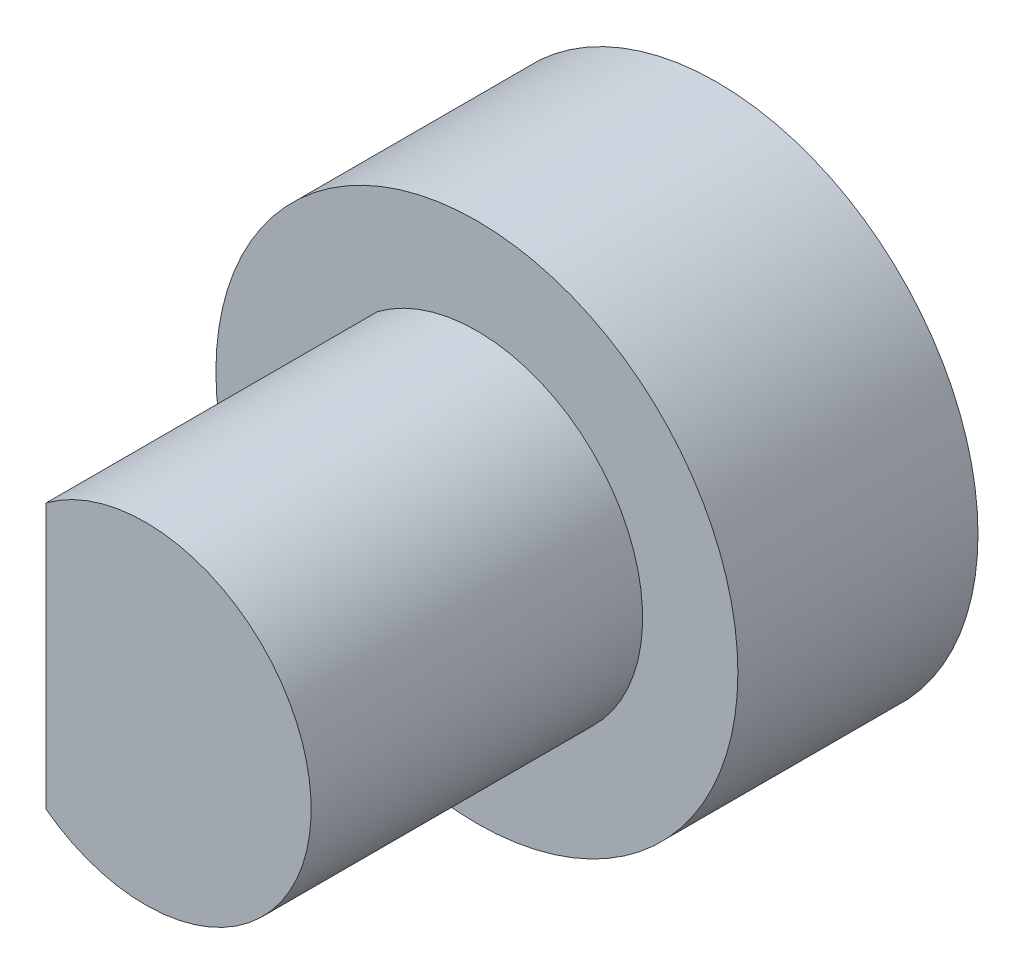
ISO-10303-21;
HEADER;
FILE_DESCRIPTION(('STEP AP214'),'2;1');
FILE_NAME('part.step','',(''),(''),'','','');
FILE_SCHEMA(('AUTOMOTIVE_DESIGN { 1 0 10303 214 1 1 1 1 }'));
ENDSEC;
DATA;
#1=APPLICATION_CONTEXT('core data for automotive mechanical design processes');
#2=APPLICATION_PROTOCOL_DEFINITION('international standard','automotive_design',2000,#1);
#3=PRODUCT_CONTEXT('',#1,'mechanical');
#4=PRODUCT('Part','Part','',(#3));
#5=PRODUCT_RELATED_PRODUCT_CATEGORY('part','',(#4));
#6=PRODUCT_DEFINITION_FORMATION('','',#4);
#7=PRODUCT_DEFINITION_CONTEXT('part definition',#1,'design');
#8=PRODUCT_DEFINITION('design','',#6,#7);
#9=PRODUCT_DEFINITION_SHAPE('','',#8);
#10=(LENGTH_UNIT() NAMED_UNIT(*) SI_UNIT(.MILLI.,.METRE.));
#11=(NAMED_UNIT(*) PLANE_ANGLE_UNIT() SI_UNIT($,.RADIAN.));
#12=(NAMED_UNIT(*) SI_UNIT($,.STERADIAN.) SOLID_ANGLE_UNIT());
#13=UNCERTAINTY_MEASURE_WITH_UNIT(LENGTH_MEASURE(1.E-05),#10,'distance_accuracy_value','');
#14=(GEOMETRIC_REPRESENTATION_CONTEXT(3) GLOBAL_UNCERTAINTY_ASSIGNED_CONTEXT((#13)) GLOBAL_UNIT_ASSIGNED_CONTEXT((#10,
#11,#12)) REPRESENTATION_CONTEXT('',''));
#15=CARTESIAN_POINT('',(0.,0.,0.));
#16=DIRECTION('',(0.,0.,1.));
#17=DIRECTION('',(1.,0.,0.));
#18=AXIS2_PLACEMENT_3D('',#15,#16,#17);
#19=CARTESIAN_POINT('',(0.,0.,3.05));
#20=DIRECTION('',(0.,0.,1.));
#21=DIRECTION('',(1.,0.,0.));
#22=AXIS2_PLACEMENT_3D('',#19,#20,#21);
#23=PLANE('',#22);
#24=CARTESIAN_POINT('',(0.,0.,3.05));
#25=DIRECTION('',(0.,0.,-1.));
#26=DIRECTION('',(-1.,0.,0.));
#27=AXIS2_PLACEMENT_3D('',#24,#25,#26);
#28=CIRCLE('',#27,1.3890625);
#29=CARTESIAN_POINT('',(-1.3890625,0.,3.05));
#30=VERTEX_POINT('',#29);
#31=EDGE_CURVE('E85',#30,#30,#28,.T.);
#32=ORIENTED_EDGE('',*,*,#31,.F.);
#33=EDGE_LOOP('',(#32));
#34=FACE_BOUND('',#33,.T.);
#35=CARTESIAN_POINT('',(0.,0.,3.05));
#36=DIRECTION('',(0.,0.,-1.));
#37=DIRECTION('',(-1.,0.,0.));
#38=AXIS2_PLACEMENT_3D('',#35,#36,#37);
#39=CIRCLE('',#38,5.);
#40=CARTESIAN_POINT('',(-5.,0.,3.05));
#41=VERTEX_POINT('',#40);
#42=EDGE_CURVE('E69',#41,#41,#39,.T.);
#43=ORIENTED_EDGE('',*,*,#42,.T.);
#44=EDGE_LOOP('',(#43));
#45=FACE_BOUND('',#44,.T.);
#46=ADVANCED_FACE('F36',(#34,#45),#23,.F.);
#47=CARTESIAN_POINT('',(0.,0.,21.7921356237309));
#48=DIRECTION('',(0.,0.,-1.));
#49=DIRECTION('',(-1.,0.,0.));
#50=AXIS2_PLACEMENT_3D('',#47,#48,#49);
#51=CYLINDRICAL_SURFACE('',#50,5.);
#52=ORIENTED_EDGE('',*,*,#42,.F.);
#53=EDGE_LOOP('',(#52));
#54=FACE_BOUND('',#53,.T.);
#55=CARTESIAN_POINT('',(0.,0.,7.65));
#56=DIRECTION('',(0.,0.,1.));
#57=DIRECTION('',(1.,0.,0.));
#58=AXIS2_PLACEMENT_3D('',#55,#56,#57);
#59=CIRCLE('',#58,5.);
#60=CARTESIAN_POINT('',(5.,0.,7.65));
#61=VERTEX_POINT('',#60);
#62=EDGE_CURVE('E77',#61,#61,#59,.F.);
#63=ORIENTED_EDGE('',*,*,#62,.T.);
#64=EDGE_LOOP('',(#63));
#65=FACE_BOUND('',#64,.T.);
#66=ADVANCED_FACE('F94',(#54,#65),#51,.T.);
#67=CARTESIAN_POINT('',(0.,0.,14.));
#68=DIRECTION('',(0.,0.,1.));
#69=DIRECTION('',(1.,0.,0.));
#70=AXIS2_PLACEMENT_3D('',#67,#68,#69);
#71=PLANE('',#70);
#72=DIRECTION('',(0.,1.,0.));
#73=VECTOR('',#72,1.);
#74=CARTESIAN_POINT('',(-1.905,2.54,14.));
#75=LINE('',#74,#73);
#76=CARTESIAN_POINT('',(-1.905,-2.54,14.));
#77=VERTEX_POINT('',#76);
#78=CARTESIAN_POINT('',(-1.905,2.54,14.));
#79=VERTEX_POINT('',#78);
#80=EDGE_CURVE('E68',#77,#79,#75,.T.);
#81=ORIENTED_EDGE('',*,*,#80,.F.);
#82=CARTESIAN_POINT('',(0.,0.,14.));
#83=DIRECTION('',(0.,0.,1.));
#84=DIRECTION('',(1.,0.,0.));
#85=AXIS2_PLACEMENT_3D('',#82,#83,#84);
#86=CIRCLE('',#85,3.175);
#87=EDGE_CURVE('E12',#77,#79,#86,.T.);
#88=ORIENTED_EDGE('',*,*,#87,.T.);
#89=EDGE_LOOP('',(#81,#88));
#90=FACE_BOUND('',#89,.T.);
#91=ADVANCED_FACE('F100',(#90),#71,.T.);
#92=CARTESIAN_POINT('',(0.,0.,7.65));
#93=DIRECTION('',(0.,0.,1.));
#94=DIRECTION('',(1.,0.,0.));
#95=AXIS2_PLACEMENT_3D('',#92,#93,#94);
#96=PLANE('',#95);
#97=DIRECTION('',(0.,1.,0.));
#98=VECTOR('',#97,1.);
#99=CARTESIAN_POINT('',(-1.905,2.54,7.65));
#100=LINE('',#99,#98);
#101=CARTESIAN_POINT('',(-1.905,-2.54,7.65));
#102=VERTEX_POINT('',#101);
#103=CARTESIAN_POINT('',(-1.905,2.54,7.65));
#104=VERTEX_POINT('',#103);
#105=EDGE_CURVE('E67',#102,#104,#100,.T.);
#106=ORIENTED_EDGE('',*,*,#105,.T.);
#107=CARTESIAN_POINT('',(0.,0.,7.65));
#108=DIRECTION('',(0.,0.,1.));
#109=DIRECTION('',(1.,0.,0.));
#110=AXIS2_PLACEMENT_3D('',#107,#108,#109);
#111=CIRCLE('',#110,3.175);
#112=EDGE_CURVE('E59',#102,#104,#111,.T.);
#113=ORIENTED_EDGE('',*,*,#112,.F.);
#114=EDGE_LOOP('',(#106,#113));
#115=FACE_BOUND('',#114,.T.);
#116=ORIENTED_EDGE('',*,*,#62,.F.);
#117=EDGE_LOOP('',(#116));
#118=FACE_BOUND('',#117,.T.);
#119=ADVANCED_FACE('F65',(#115,#118),#96,.T.);
#120=CARTESIAN_POINT('',(-1.905,2.54,7.65));
#121=DIRECTION('',(1.,0.,0.));
#122=DIRECTION('',(0.,0.,-1.));
#123=AXIS2_PLACEMENT_3D('',#120,#121,#122);
#124=PLANE('',#123);
#125=ORIENTED_EDGE('',*,*,#80,.T.);
#126=DIRECTION('',(0.,0.,1.));
#127=VECTOR('',#126,1.);
#128=CARTESIAN_POINT('',(-1.905,2.54,7.65));
#129=LINE('',#128,#127);
#130=EDGE_CURVE('E44',#104,#79,#129,.T.);
#131=ORIENTED_EDGE('',*,*,#130,.F.);
#132=ORIENTED_EDGE('',*,*,#105,.F.);
#133=DIRECTION('',(0.,0.,1.));
#134=VECTOR('',#133,1.);
#135=CARTESIAN_POINT('',(-1.905,-2.54,7.65));
#136=LINE('',#135,#134);
#137=EDGE_CURVE('E51',#102,#77,#136,.T.);
#138=ORIENTED_EDGE('',*,*,#137,.T.);
#139=EDGE_LOOP('',(#125,#131,#132,#138));
#140=FACE_BOUND('',#139,.T.);
#141=ADVANCED_FACE('F71',(#140),#124,.F.);
#142=CARTESIAN_POINT('',(0.,0.,14.));
#143=DIRECTION('',(0.,0.,-1.));
#144=DIRECTION('',(-1.,0.,0.));
#145=AXIS2_PLACEMENT_3D('',#142,#143,#144);
#146=CYLINDRICAL_SURFACE('',#145,3.175);
#147=ORIENTED_EDGE('',*,*,#137,.F.);
#148=ORIENTED_EDGE('',*,*,#112,.T.);
#149=ORIENTED_EDGE('',*,*,#130,.T.);
#150=ORIENTED_EDGE('',*,*,#87,.F.);
#151=EDGE_LOOP('',(#147,#148,#149,#150));
#152=FACE_BOUND('',#151,.T.);
#153=ADVANCED_FACE('F38',(#152),#146,.T.);
#154=CARTESIAN_POINT('',(0.,0.,7.65));
#155=DIRECTION('',(0.,0.,1.));
#156=DIRECTION('',(1.,0.,0.));
#157=AXIS2_PLACEMENT_3D('',#154,#155,#156);
#158=PLANE('',#157);
#159=CARTESIAN_POINT('',(0.,0.,7.65));
#160=DIRECTION('',(0.,0.,1.));
#161=DIRECTION('',(1.,0.,0.));
#162=AXIS2_PLACEMENT_3D('',#159,#160,#161);
#163=CIRCLE('',#162,1.3890625);
#164=CARTESIAN_POINT('',(1.3890625,0.,7.65));
#165=VERTEX_POINT('',#164);
#166=EDGE_CURVE('E80',#165,#165,#163,.F.);
#167=ORIENTED_EDGE('',*,*,#166,.T.);
#168=EDGE_LOOP('',(#167));
#169=FACE_BOUND('',#168,.T.);
#170=ADVANCED_FACE('F112',(#169),#158,.F.);
#171=CARTESIAN_POINT('',(0.,0.,11.5788620529678));
#172=DIRECTION('',(0.,0.,-1.));
#173=DIRECTION('',(-1.,0.,0.));
#174=AXIS2_PLACEMENT_3D('',#171,#172,#173);
#175=CYLINDRICAL_SURFACE('',#174,1.3890625);
#176=ORIENTED_EDGE('',*,*,#31,.T.);
#177=EDGE_LOOP('',(#176));
#178=FACE_BOUND('',#177,.T.);
#179=ORIENTED_EDGE('',*,*,#166,.F.);
#180=EDGE_LOOP('',(#179));
#181=FACE_BOUND('',#180,.T.);
#182=ADVANCED_FACE('F89',(#178,#181),#175,.F.);
#183=CLOSED_SHELL('',(#46,#66,#91,#119,#141,#153,#170,#182));
#184=MANIFOLD_SOLID_BREP('B2',#183);
#185=ADVANCED_BREP_SHAPE_REPRESENTATION('',(#18,#184),#14);
#186=SHAPE_DEFINITION_REPRESENTATION(#9,#185);
ENDSEC;
END-ISO-10303-21;
